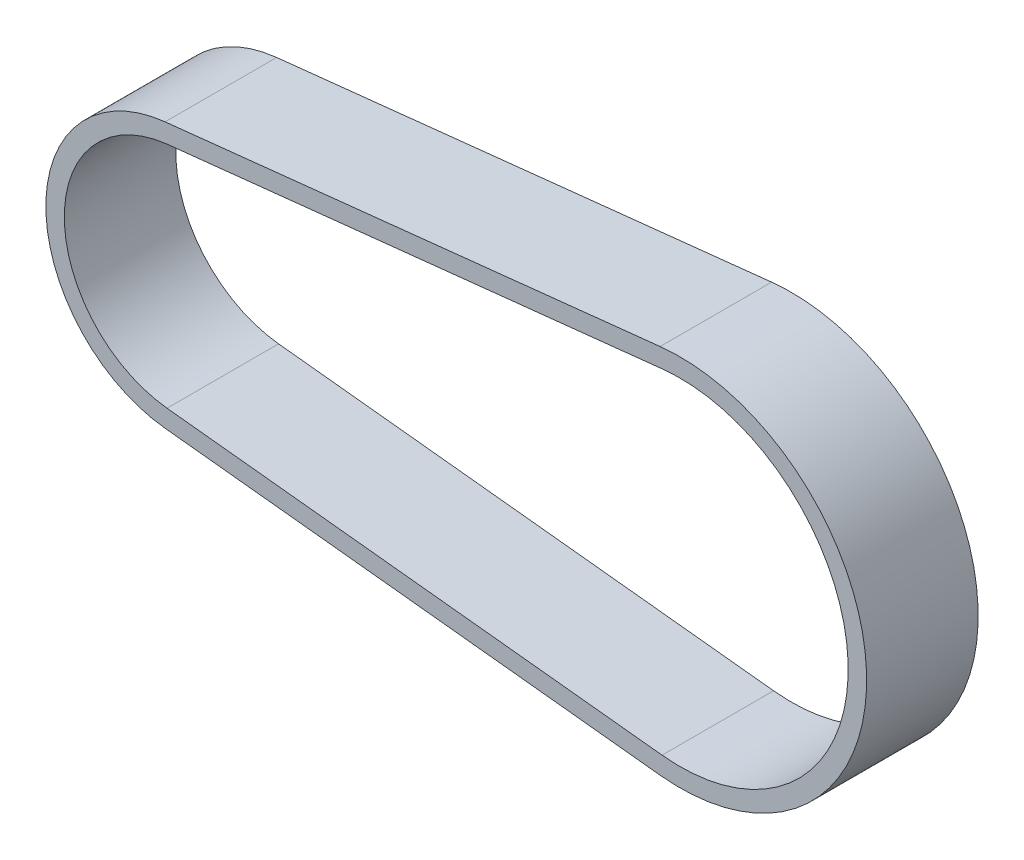
ISO-10303-21;
HEADER;
FILE_DESCRIPTION(('STEP AP214'),'2;1');
FILE_NAME('part.step','',(''),(''),'','','');
FILE_SCHEMA(('AUTOMOTIVE_DESIGN { 1 0 10303 214 1 1 1 1 }'));
ENDSEC;
DATA;
#1=APPLICATION_CONTEXT('core data for automotive mechanical design processes');
#2=APPLICATION_PROTOCOL_DEFINITION('international standard','automotive_design',2000,#1);
#3=PRODUCT_CONTEXT('',#1,'mechanical');
#4=PRODUCT('Part','Part','',(#3));
#5=PRODUCT_RELATED_PRODUCT_CATEGORY('part','',(#4));
#6=PRODUCT_DEFINITION_FORMATION('','',#4);
#7=PRODUCT_DEFINITION_CONTEXT('part definition',#1,'design');
#8=PRODUCT_DEFINITION('design','',#6,#7);
#9=PRODUCT_DEFINITION_SHAPE('','',#8);
#10=(LENGTH_UNIT() NAMED_UNIT(*) SI_UNIT(.MILLI.,.METRE.));
#11=(NAMED_UNIT(*) PLANE_ANGLE_UNIT() SI_UNIT($,.RADIAN.));
#12=(NAMED_UNIT(*) SI_UNIT($,.STERADIAN.) SOLID_ANGLE_UNIT());
#13=UNCERTAINTY_MEASURE_WITH_UNIT(LENGTH_MEASURE(1.E-05),#10,'distance_accuracy_value','');
#14=(GEOMETRIC_REPRESENTATION_CONTEXT(3) GLOBAL_UNCERTAINTY_ASSIGNED_CONTEXT((#13)) GLOBAL_UNIT_ASSIGNED_CONTEXT((#10,
#11,#12)) REPRESENTATION_CONTEXT('',''));
#15=CARTESIAN_POINT('',(0.,0.,0.));
#16=DIRECTION('',(0.,0.,1.));
#17=DIRECTION('',(1.,0.,0.));
#18=AXIS2_PLACEMENT_3D('',#15,#16,#17);
#19=CARTESIAN_POINT('',(0.,0.,20.));
#20=DIRECTION('',(0.,0.,-1.));
#21=DIRECTION('',(-1.,0.,0.));
#22=AXIS2_PLACEMENT_3D('',#19,#20,#21);
#23=PLANE('',#22);
#24=CARTESIAN_POINT('',(0.,0.,20.));
#25=DIRECTION('',(0.,0.,-1.));
#26=DIRECTION('',(-1.,0.,0.));
#27=AXIS2_PLACEMENT_3D('',#24,#25,#26);
#28=CIRCLE('',#27,33.485);
#29=CARTESIAN_POINT('',(-3.56104398663697,-33.2951076094557,20.));
#30=VERTEX_POINT('',#29);
#31=CARTESIAN_POINT('',(-3.56104398663698,33.2951076094557,20.));
#32=VERTEX_POINT('',#31);
#33=EDGE_CURVE('E157',#30,#32,#28,.F.);
#34=ORIENTED_EDGE('',*,*,#33,.T.);
#35=DIRECTION('',(-0.994329031191749,-0.106347438752784,0.));
#36=VECTOR('',#35,1.);
#37=CARTESIAN_POINT('',(-3.56104398663697,33.2951076094557,20.));
#38=LINE('',#37,#36);
#39=CARTESIAN_POINT('',(-92.3454259465479,23.7992653615745,20.));
#40=VERTEX_POINT('',#39);
#41=EDGE_CURVE('E160',#32,#40,#38,.T.);
#42=ORIENTED_EDGE('',*,*,#41,.T.);
#43=CARTESIAN_POINT('',(-89.8,0.,20.));
#44=DIRECTION('',(0.,0.,-1.));
#45=DIRECTION('',(-1.,0.,0.));
#46=AXIS2_PLACEMENT_3D('',#43,#44,#45);
#47=CIRCLE('',#46,23.935);
#48=CARTESIAN_POINT('',(-92.3454259465479,-23.7992653615745,20.));
#49=VERTEX_POINT('',#48);
#50=EDGE_CURVE('E163',#40,#49,#47,.F.);
#51=ORIENTED_EDGE('',*,*,#50,.T.);
#52=DIRECTION('',(0.994329031191749,-0.106347438752784,0.));
#53=VECTOR('',#52,1.);
#54=CARTESIAN_POINT('',(-3.56104398663697,-33.2951076094557,20.));
#55=LINE('',#54,#53);
#56=EDGE_CURVE('E165',#49,#30,#55,.T.);
#57=ORIENTED_EDGE('',*,*,#56,.T.);
#58=EDGE_LOOP('',(#34,#42,#51,#57));
#59=FACE_BOUND('',#58,.T.);
#60=CARTESIAN_POINT('',(0.,0.,20.));
#61=DIRECTION('',(0.,0.,-1.));
#62=DIRECTION('',(-1.,0.,0.));
#63=AXIS2_PLACEMENT_3D('',#60,#61,#62);
#64=CIRCLE('',#63,30.175);
#65=CARTESIAN_POINT('',(-3.20903396436526,-30.003878516211,20.));
#66=VERTEX_POINT('',#65);
#67=CARTESIAN_POINT('',(-3.20903396436525,30.003878516211,20.));
#68=VERTEX_POINT('',#67);
#69=EDGE_CURVE('E121',#66,#68,#64,.F.);
#70=ORIENTED_EDGE('',*,*,#69,.F.);
#71=DIRECTION('',(0.994329031191749,-0.106347438752784,0.));
#72=VECTOR('',#71,1.);
#73=CARTESIAN_POINT('',(-3.20903396436526,-30.003878516211,20.));
#74=LINE('',#73,#72);
#75=CARTESIAN_POINT('',(-91.9934159242762,-20.5080362683298,20.));
#76=VERTEX_POINT('',#75);
#77=EDGE_CURVE('E143',#76,#66,#74,.T.);
#78=ORIENTED_EDGE('',*,*,#77,.F.);
#79=CARTESIAN_POINT('',(-89.8,0.,20.));
#80=DIRECTION('',(0.,0.,-1.));
#81=DIRECTION('',(-1.,0.,0.));
#82=AXIS2_PLACEMENT_3D('',#79,#80,#81);
#83=CIRCLE('',#82,20.625);
#84=CARTESIAN_POINT('',(-91.9934159242761,20.5080362683298,20.));
#85=VERTEX_POINT('',#84);
#86=EDGE_CURVE('E141',#85,#76,#83,.F.);
#87=ORIENTED_EDGE('',*,*,#86,.F.);
#88=DIRECTION('',(-0.994329031191749,-0.106347438752784,0.));
#89=VECTOR('',#88,1.);
#90=CARTESIAN_POINT('',(-3.20903396436526,30.003878516211,20.));
#91=LINE('',#90,#89);
#92=EDGE_CURVE('E129',#68,#85,#91,.T.);
#93=ORIENTED_EDGE('',*,*,#92,.F.);
#94=EDGE_LOOP('',(#70,#78,#87,#93));
#95=FACE_BOUND('',#94,.T.);
#96=ADVANCED_FACE('F56',(#59,#95),#23,.F.);
#97=CARTESIAN_POINT('',(0.,0.,0.));
#98=DIRECTION('',(0.,0.,-1.));
#99=DIRECTION('',(-1.,0.,0.));
#100=AXIS2_PLACEMENT_3D('',#97,#98,#99);
#101=PLANE('',#100);
#102=CARTESIAN_POINT('',(0.,0.,0.));
#103=DIRECTION('',(0.,0.,-1.));
#104=DIRECTION('',(-1.,0.,0.));
#105=AXIS2_PLACEMENT_3D('',#102,#103,#104);
#106=CIRCLE('',#105,33.485);
#107=CARTESIAN_POINT('',(-3.56104398663697,-33.2951076094557,0.));
#108=VERTEX_POINT('',#107);
#109=CARTESIAN_POINT('',(-3.56104398663698,33.2951076094557,0.));
#110=VERTEX_POINT('',#109);
#111=EDGE_CURVE('E137',#108,#110,#106,.F.);
#112=ORIENTED_EDGE('',*,*,#111,.F.);
#113=DIRECTION('',(0.994329031191749,-0.106347438752784,0.));
#114=VECTOR('',#113,1.);
#115=CARTESIAN_POINT('',(-3.56104398663697,-33.2951076094557,0.));
#116=LINE('',#115,#114);
#117=CARTESIAN_POINT('',(-92.3454259465479,-23.7992653615745,0.));
#118=VERTEX_POINT('',#117);
#119=EDGE_CURVE('E161',#118,#108,#116,.T.);
#120=ORIENTED_EDGE('',*,*,#119,.F.);
#121=CARTESIAN_POINT('',(-89.8,0.,0.));
#122=DIRECTION('',(0.,0.,-1.));
#123=DIRECTION('',(-1.,0.,0.));
#124=AXIS2_PLACEMENT_3D('',#121,#122,#123);
#125=CIRCLE('',#124,23.935);
#126=CARTESIAN_POINT('',(-92.3454259465479,23.7992653615745,0.));
#127=VERTEX_POINT('',#126);
#128=EDGE_CURVE('E172',#127,#118,#125,.F.);
#129=ORIENTED_EDGE('',*,*,#128,.F.);
#130=DIRECTION('',(-0.994329031191749,-0.106347438752784,0.));
#131=VECTOR('',#130,1.);
#132=CARTESIAN_POINT('',(-3.56104398663697,33.2951076094557,0.));
#133=LINE('',#132,#131);
#134=EDGE_CURVE('E170',#110,#127,#133,.T.);
#135=ORIENTED_EDGE('',*,*,#134,.F.);
#136=EDGE_LOOP('',(#112,#120,#129,#135));
#137=FACE_BOUND('',#136,.T.);
#138=DIRECTION('',(0.994329031191749,-0.106347438752784,0.));
#139=VECTOR('',#138,1.);
#140=CARTESIAN_POINT('',(-3.20903396436526,-30.003878516211,0.));
#141=LINE('',#140,#139);
#142=CARTESIAN_POINT('',(-91.9934159242761,-20.5080362683298,0.));
#143=VERTEX_POINT('',#142);
#144=CARTESIAN_POINT('',(-3.20903396436526,-30.003878516211,0.));
#145=VERTEX_POINT('',#144);
#146=EDGE_CURVE('E130',#143,#145,#141,.T.);
#147=ORIENTED_EDGE('',*,*,#146,.T.);
#148=CARTESIAN_POINT('',(0.,0.,0.));
#149=DIRECTION('',(0.,0.,-1.));
#150=DIRECTION('',(-1.,0.,0.));
#151=AXIS2_PLACEMENT_3D('',#148,#149,#150);
#152=CIRCLE('',#151,30.175);
#153=CARTESIAN_POINT('',(-3.20903396436525,30.003878516211,0.));
#154=VERTEX_POINT('',#153);
#155=EDGE_CURVE('E79',#145,#154,#152,.F.);
#156=ORIENTED_EDGE('',*,*,#155,.T.);
#157=DIRECTION('',(-0.994329031191749,-0.106347438752784,0.));
#158=VECTOR('',#157,1.);
#159=CARTESIAN_POINT('',(-3.20903396436526,30.003878516211,0.));
#160=LINE('',#159,#158);
#161=CARTESIAN_POINT('',(-91.9934159242761,20.5080362683298,0.));
#162=VERTEX_POINT('',#161);
#163=EDGE_CURVE('E136',#154,#162,#160,.T.);
#164=ORIENTED_EDGE('',*,*,#163,.T.);
#165=CARTESIAN_POINT('',(-89.8,0.,0.));
#166=DIRECTION('',(0.,0.,-1.));
#167=DIRECTION('',(-1.,0.,0.));
#168=AXIS2_PLACEMENT_3D('',#165,#166,#167);
#169=CIRCLE('',#168,20.625);
#170=EDGE_CURVE('E149',#162,#143,#169,.F.);
#171=ORIENTED_EDGE('',*,*,#170,.T.);
#172=EDGE_LOOP('',(#147,#156,#164,#171));
#173=FACE_BOUND('',#172,.T.);
#174=ADVANCED_FACE('F190',(#137,#173),#101,.T.);
#175=CARTESIAN_POINT('',(0.,0.,20.));
#176=DIRECTION('',(0.,0.,-1.));
#177=DIRECTION('',(-1.,0.,0.));
#178=AXIS2_PLACEMENT_3D('',#175,#176,#177);
#179=CYLINDRICAL_SURFACE('',#178,33.485);
#180=ORIENTED_EDGE('',*,*,#111,.T.);
#181=DIRECTION('',(0.,0.,-1.));
#182=VECTOR('',#181,1.);
#183=CARTESIAN_POINT('',(-3.56104398663698,33.2951076094557,20.));
#184=LINE('',#183,#182);
#185=EDGE_CURVE('E12',#32,#110,#184,.T.);
#186=ORIENTED_EDGE('',*,*,#185,.F.);
#187=ORIENTED_EDGE('',*,*,#33,.F.);
#188=DIRECTION('',(0.,0.,-1.));
#189=VECTOR('',#188,1.);
#190=CARTESIAN_POINT('',(-3.56104398663697,-33.2951076094557,20.));
#191=LINE('',#190,#189);
#192=EDGE_CURVE('E167',#30,#108,#191,.T.);
#193=ORIENTED_EDGE('',*,*,#192,.T.);
#194=EDGE_LOOP('',(#180,#186,#187,#193));
#195=FACE_BOUND('',#194,.T.);
#196=ADVANCED_FACE('F58',(#195),#179,.T.);
#197=CARTESIAN_POINT('',(-3.56104398663697,33.2951076094557,20.));
#198=DIRECTION('',(0.106347438752784,-0.994329031191749,0.));
#199=DIRECTION('',(0.994329031191749,0.106347438752784,0.));
#200=AXIS2_PLACEMENT_3D('',#197,#198,#199);
#201=PLANE('',#200);
#202=ORIENTED_EDGE('',*,*,#134,.T.);
#203=DIRECTION('',(0.,0.,-1.));
#204=VECTOR('',#203,1.);
#205=CARTESIAN_POINT('',(-92.3454259465479,23.7992653615745,20.));
#206=LINE('',#205,#204);
#207=EDGE_CURVE('E64',#40,#127,#206,.T.);
#208=ORIENTED_EDGE('',*,*,#207,.F.);
#209=ORIENTED_EDGE('',*,*,#41,.F.);
#210=ORIENTED_EDGE('',*,*,#185,.T.);
#211=EDGE_LOOP('',(#202,#208,#209,#210));
#212=FACE_BOUND('',#211,.T.);
#213=ADVANCED_FACE('F200',(#212),#201,.F.);
#214=CARTESIAN_POINT('',(-89.8,0.,20.));
#215=DIRECTION('',(0.,0.,-1.));
#216=DIRECTION('',(-1.,0.,0.));
#217=AXIS2_PLACEMENT_3D('',#214,#215,#216);
#218=CYLINDRICAL_SURFACE('',#217,23.935);
#219=ORIENTED_EDGE('',*,*,#128,.T.);
#220=DIRECTION('',(0.,0.,-1.));
#221=VECTOR('',#220,1.);
#222=CARTESIAN_POINT('',(-92.3454259465479,-23.7992653615745,20.));
#223=LINE('',#222,#221);
#224=EDGE_CURVE('E177',#49,#118,#223,.T.);
#225=ORIENTED_EDGE('',*,*,#224,.F.);
#226=ORIENTED_EDGE('',*,*,#50,.F.);
#227=ORIENTED_EDGE('',*,*,#207,.T.);
#228=EDGE_LOOP('',(#219,#225,#226,#227));
#229=FACE_BOUND('',#228,.T.);
#230=ADVANCED_FACE('F184',(#229),#218,.T.);
#231=CARTESIAN_POINT('',(-3.56104398663697,-33.2951076094557,20.));
#232=DIRECTION('',(0.106347438752784,0.994329031191749,0.));
#233=DIRECTION('',(-0.994329031191749,0.106347438752784,0.));
#234=AXIS2_PLACEMENT_3D('',#231,#232,#233);
#235=PLANE('',#234);
#236=ORIENTED_EDGE('',*,*,#119,.T.);
#237=ORIENTED_EDGE('',*,*,#192,.F.);
#238=ORIENTED_EDGE('',*,*,#56,.F.);
#239=ORIENTED_EDGE('',*,*,#224,.T.);
#240=EDGE_LOOP('',(#236,#237,#238,#239));
#241=FACE_BOUND('',#240,.T.);
#242=ADVANCED_FACE('F194',(#241),#235,.F.);
#243=CARTESIAN_POINT('',(0.,0.,20.));
#244=DIRECTION('',(0.,0.,-1.));
#245=DIRECTION('',(-1.,0.,0.));
#246=AXIS2_PLACEMENT_3D('',#243,#244,#245);
#247=CYLINDRICAL_SURFACE('',#246,30.175);
#248=ORIENTED_EDGE('',*,*,#155,.F.);
#249=DIRECTION('',(0.,0.,-1.));
#250=VECTOR('',#249,1.);
#251=CARTESIAN_POINT('',(-3.20903396436526,-30.003878516211,20.));
#252=LINE('',#251,#250);
#253=EDGE_CURVE('E125',#66,#145,#252,.T.);
#254=ORIENTED_EDGE('',*,*,#253,.F.);
#255=ORIENTED_EDGE('',*,*,#69,.T.);
#256=DIRECTION('',(0.,0.,-1.));
#257=VECTOR('',#256,1.);
#258=CARTESIAN_POINT('',(-3.20903396436525,30.003878516211,20.));
#259=LINE('',#258,#257);
#260=EDGE_CURVE('E124',#68,#154,#259,.T.);
#261=ORIENTED_EDGE('',*,*,#260,.T.);
#262=EDGE_LOOP('',(#248,#254,#255,#261));
#263=FACE_BOUND('',#262,.T.);
#264=ADVANCED_FACE('F123',(#263),#247,.F.);
#265=CARTESIAN_POINT('',(-3.20903396436526,30.003878516211,20.));
#266=DIRECTION('',(0.106347438752784,-0.994329031191749,0.));
#267=DIRECTION('',(0.994329031191749,0.106347438752784,0.));
#268=AXIS2_PLACEMENT_3D('',#265,#266,#267);
#269=PLANE('',#268);
#270=ORIENTED_EDGE('',*,*,#163,.F.);
#271=ORIENTED_EDGE('',*,*,#260,.F.);
#272=ORIENTED_EDGE('',*,*,#92,.T.);
#273=DIRECTION('',(0.,0.,-1.));
#274=VECTOR('',#273,1.);
#275=CARTESIAN_POINT('',(-91.9934159242761,20.5080362683298,20.));
#276=LINE('',#275,#274);
#277=EDGE_CURVE('E138',#85,#162,#276,.T.);
#278=ORIENTED_EDGE('',*,*,#277,.T.);
#279=EDGE_LOOP('',(#270,#271,#272,#278));
#280=FACE_BOUND('',#279,.T.);
#281=ADVANCED_FACE('F133',(#280),#269,.T.);
#282=CARTESIAN_POINT('',(-89.8,0.,20.));
#283=DIRECTION('',(0.,0.,-1.));
#284=DIRECTION('',(-1.,0.,0.));
#285=AXIS2_PLACEMENT_3D('',#282,#283,#284);
#286=CYLINDRICAL_SURFACE('',#285,20.625);
#287=ORIENTED_EDGE('',*,*,#170,.F.);
#288=ORIENTED_EDGE('',*,*,#277,.F.);
#289=ORIENTED_EDGE('',*,*,#86,.T.);
#290=DIRECTION('',(0.,0.,-1.));
#291=VECTOR('',#290,1.);
#292=CARTESIAN_POINT('',(-91.9934159242761,-20.5080362683298,20.));
#293=LINE('',#292,#291);
#294=EDGE_CURVE('E71',#76,#143,#293,.T.);
#295=ORIENTED_EDGE('',*,*,#294,.T.);
#296=EDGE_LOOP('',(#287,#288,#289,#295));
#297=FACE_BOUND('',#296,.T.);
#298=ADVANCED_FACE('F223',(#297),#286,.F.);
#299=CARTESIAN_POINT('',(-3.20903396436526,-30.003878516211,20.));
#300=DIRECTION('',(0.106347438752784,0.994329031191749,0.));
#301=DIRECTION('',(-0.994329031191749,0.106347438752784,0.));
#302=AXIS2_PLACEMENT_3D('',#299,#300,#301);
#303=PLANE('',#302);
#304=ORIENTED_EDGE('',*,*,#146,.F.);
#305=ORIENTED_EDGE('',*,*,#294,.F.);
#306=ORIENTED_EDGE('',*,*,#77,.T.);
#307=ORIENTED_EDGE('',*,*,#253,.T.);
#308=EDGE_LOOP('',(#304,#305,#306,#307));
#309=FACE_BOUND('',#308,.T.);
#310=ADVANCED_FACE('F227',(#309),#303,.T.);
#311=CLOSED_SHELL('',(#96,#174,#196,#213,#230,#242,#264,#281,#298,#310));
#312=MANIFOLD_SOLID_BREP('B2',#311);
#313=ADVANCED_BREP_SHAPE_REPRESENTATION('',(#18,#312),#14);
#314=SHAPE_DEFINITION_REPRESENTATION(#9,#313);
ENDSEC;
END-ISO-10303-21;
